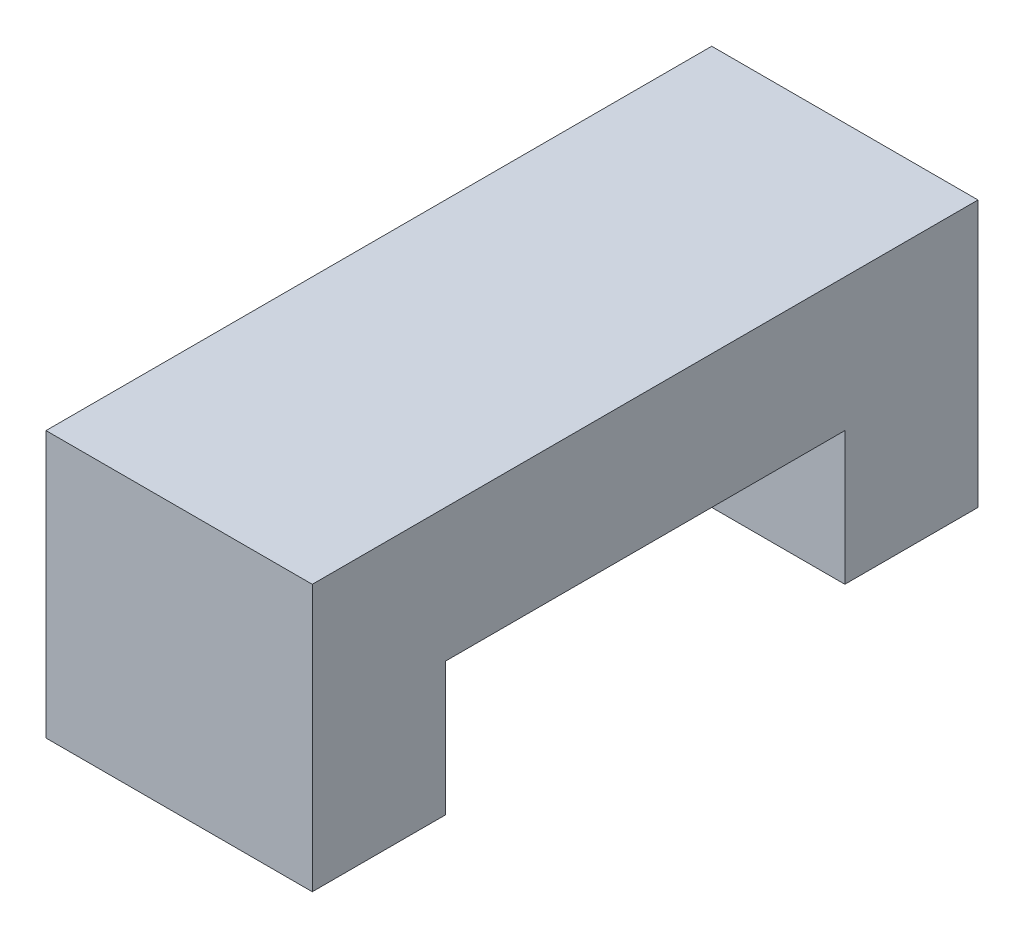
ISO-10303-21;
HEADER;
FILE_DESCRIPTION(('STEP AP214'),'2;1');
FILE_NAME('part.step','',(''),(''),'','','');
FILE_SCHEMA(('AUTOMOTIVE_DESIGN { 1 0 10303 214 1 1 1 1 }'));
ENDSEC;
DATA;
#1=APPLICATION_CONTEXT('core data for automotive mechanical design processes');
#2=APPLICATION_PROTOCOL_DEFINITION('international standard','automotive_design',2000,#1);
#3=PRODUCT_CONTEXT('',#1,'mechanical');
#4=PRODUCT('Part','Part','',(#3));
#5=PRODUCT_RELATED_PRODUCT_CATEGORY('part','',(#4));
#6=PRODUCT_DEFINITION_FORMATION('','',#4);
#7=PRODUCT_DEFINITION_CONTEXT('part definition',#1,'design');
#8=PRODUCT_DEFINITION('design','',#6,#7);
#9=PRODUCT_DEFINITION_SHAPE('','',#8);
#10=(LENGTH_UNIT() NAMED_UNIT(*) SI_UNIT(.MILLI.,.METRE.));
#11=(NAMED_UNIT(*) PLANE_ANGLE_UNIT() SI_UNIT($,.RADIAN.));
#12=(NAMED_UNIT(*) SI_UNIT($,.STERADIAN.) SOLID_ANGLE_UNIT());
#13=UNCERTAINTY_MEASURE_WITH_UNIT(LENGTH_MEASURE(1.E-05),#10,'distance_accuracy_value','');
#14=(GEOMETRIC_REPRESENTATION_CONTEXT(3) GLOBAL_UNCERTAINTY_ASSIGNED_CONTEXT((#13)) GLOBAL_UNIT_ASSIGNED_CONTEXT((#10,
#11,#12)) REPRESENTATION_CONTEXT('',''));
#15=CARTESIAN_POINT('',(0.,0.,0.));
#16=DIRECTION('',(0.,0.,1.));
#17=DIRECTION('',(1.,0.,0.));
#18=AXIS2_PLACEMENT_3D('',#15,#16,#17);
#19=CARTESIAN_POINT('',(10.,5.,0.));
#20=DIRECTION('',(0.,0.,1.));
#21=DIRECTION('',(1.,0.,0.));
#22=AXIS2_PLACEMENT_3D('',#19,#20,#21);
#23=PLANE('',#22);
#24=DIRECTION('',(0.,1.,0.));
#25=VECTOR('',#24,1.);
#26=CARTESIAN_POINT('',(0.,5.,0.));
#27=LINE('',#26,#25);
#28=CARTESIAN_POINT('',(0.,0.,0.));
#29=VERTEX_POINT('',#28);
#30=CARTESIAN_POINT('',(0.,5.,0.));
#31=VERTEX_POINT('',#30);
#32=EDGE_CURVE('E139',#29,#31,#27,.T.);
#33=ORIENTED_EDGE('',*,*,#32,.T.);
#34=DIRECTION('',(-1.,0.,0.));
#35=VECTOR('',#34,1.);
#36=CARTESIAN_POINT('',(10.,5.,0.));
#37=LINE('',#36,#35);
#38=CARTESIAN_POINT('',(10.,5.,0.));
#39=VERTEX_POINT('',#38);
#40=EDGE_CURVE('E11',#39,#31,#37,.T.);
#41=ORIENTED_EDGE('',*,*,#40,.F.);
#42=DIRECTION('',(0.,1.,0.));
#43=VECTOR('',#42,1.);
#44=CARTESIAN_POINT('',(10.,5.,0.));
#45=LINE('',#44,#43);
#46=CARTESIAN_POINT('',(10.,0.,0.));
#47=VERTEX_POINT('',#46);
#48=EDGE_CURVE('E153',#47,#39,#45,.T.);
#49=ORIENTED_EDGE('',*,*,#48,.F.);
#50=DIRECTION('',(-1.,0.,0.));
#51=VECTOR('',#50,1.);
#52=CARTESIAN_POINT('',(10.,0.,0.));
#53=LINE('',#52,#51);
#54=EDGE_CURVE('E135',#47,#29,#53,.T.);
#55=ORIENTED_EDGE('',*,*,#54,.T.);
#56=EDGE_LOOP('',(#33,#41,#49,#55));
#57=FACE_BOUND('',#56,.T.);
#58=ADVANCED_FACE('F43',(#57),#23,.F.);
#59=CARTESIAN_POINT('',(10.,5.,-15.));
#60=DIRECTION('',(0.,1.,0.));
#61=DIRECTION('',(0.,0.,1.));
#62=AXIS2_PLACEMENT_3D('',#59,#60,#61);
#63=PLANE('',#62);
#64=DIRECTION('',(0.,0.,-1.));
#65=VECTOR('',#64,1.);
#66=CARTESIAN_POINT('',(0.,5.,-15.));
#67=LINE('',#66,#65);
#68=CARTESIAN_POINT('',(0.,5.,-15.));
#69=VERTEX_POINT('',#68);
#70=EDGE_CURVE('E142',#31,#69,#67,.T.);
#71=ORIENTED_EDGE('',*,*,#70,.T.);
#72=DIRECTION('',(-1.,0.,0.));
#73=VECTOR('',#72,1.);
#74=CARTESIAN_POINT('',(10.,5.,-15.));
#75=LINE('',#74,#73);
#76=CARTESIAN_POINT('',(10.,5.,-15.));
#77=VERTEX_POINT('',#76);
#78=EDGE_CURVE('E51',#77,#69,#75,.T.);
#79=ORIENTED_EDGE('',*,*,#78,.F.);
#80=DIRECTION('',(0.,0.,-1.));
#81=VECTOR('',#80,1.);
#82=CARTESIAN_POINT('',(10.,5.,-15.));
#83=LINE('',#82,#81);
#84=EDGE_CURVE('E102',#39,#77,#83,.T.);
#85=ORIENTED_EDGE('',*,*,#84,.F.);
#86=ORIENTED_EDGE('',*,*,#40,.T.);
#87=EDGE_LOOP('',(#71,#79,#85,#86));
#88=FACE_BOUND('',#87,.T.);
#89=ADVANCED_FACE('F188',(#88),#63,.F.);
#90=CARTESIAN_POINT('',(10.,0.,-15.));
#91=DIRECTION('',(0.,0.,-1.));
#92=DIRECTION('',(-1.,0.,0.));
#93=AXIS2_PLACEMENT_3D('',#90,#91,#92);
#94=PLANE('',#93);
#95=DIRECTION('',(0.,-1.,0.));
#96=VECTOR('',#95,1.);
#97=CARTESIAN_POINT('',(0.,0.,-15.));
#98=LINE('',#97,#96);
#99=CARTESIAN_POINT('',(0.,0.,-15.));
#100=VERTEX_POINT('',#99);
#101=EDGE_CURVE('E144',#69,#100,#98,.T.);
#102=ORIENTED_EDGE('',*,*,#101,.T.);
#103=DIRECTION('',(-1.,0.,0.));
#104=VECTOR('',#103,1.);
#105=CARTESIAN_POINT('',(10.,0.,-15.));
#106=LINE('',#105,#104);
#107=CARTESIAN_POINT('',(10.,0.,-15.));
#108=VERTEX_POINT('',#107);
#109=EDGE_CURVE('E160',#108,#100,#106,.T.);
#110=ORIENTED_EDGE('',*,*,#109,.F.);
#111=DIRECTION('',(0.,-1.,0.));
#112=VECTOR('',#111,1.);
#113=CARTESIAN_POINT('',(10.,0.,-15.));
#114=LINE('',#113,#112);
#115=EDGE_CURVE('E168',#77,#108,#114,.T.);
#116=ORIENTED_EDGE('',*,*,#115,.F.);
#117=ORIENTED_EDGE('',*,*,#78,.T.);
#118=EDGE_LOOP('',(#102,#110,#116,#117));
#119=FACE_BOUND('',#118,.T.);
#120=ADVANCED_FACE('F166',(#119),#94,.F.);
#121=CARTESIAN_POINT('',(10.,0.,-20.));
#122=DIRECTION('',(0.,1.,0.));
#123=DIRECTION('',(0.,0.,1.));
#124=AXIS2_PLACEMENT_3D('',#121,#122,#123);
#125=PLANE('',#124);
#126=DIRECTION('',(0.,0.,-1.));
#127=VECTOR('',#126,1.);
#128=CARTESIAN_POINT('',(0.,0.,-20.));
#129=LINE('',#128,#127);
#130=CARTESIAN_POINT('',(0.,0.,-20.));
#131=VERTEX_POINT('',#130);
#132=EDGE_CURVE('E146',#100,#131,#129,.T.);
#133=ORIENTED_EDGE('',*,*,#132,.T.);
#134=DIRECTION('',(-1.,0.,0.));
#135=VECTOR('',#134,1.);
#136=CARTESIAN_POINT('',(10.,0.,-20.));
#137=LINE('',#136,#135);
#138=CARTESIAN_POINT('',(10.,0.,-20.));
#139=VERTEX_POINT('',#138);
#140=EDGE_CURVE('E157',#139,#131,#137,.T.);
#141=ORIENTED_EDGE('',*,*,#140,.F.);
#142=DIRECTION('',(0.,0.,-1.));
#143=VECTOR('',#142,1.);
#144=CARTESIAN_POINT('',(10.,0.,-20.));
#145=LINE('',#144,#143);
#146=EDGE_CURVE('E180',#108,#139,#145,.T.);
#147=ORIENTED_EDGE('',*,*,#146,.F.);
#148=ORIENTED_EDGE('',*,*,#109,.T.);
#149=EDGE_LOOP('',(#133,#141,#147,#148));
#150=FACE_BOUND('',#149,.T.);
#151=ADVANCED_FACE('F176',(#150),#125,.F.);
#152=CARTESIAN_POINT('',(10.,10.,-20.));
#153=DIRECTION('',(0.,0.,1.));
#154=DIRECTION('',(0.,-1.,0.));
#155=AXIS2_PLACEMENT_3D('',#152,#153,#154);
#156=PLANE('',#155);
#157=DIRECTION('',(0.,1.,0.));
#158=VECTOR('',#157,1.);
#159=CARTESIAN_POINT('',(0.,10.,-20.));
#160=LINE('',#159,#158);
#161=CARTESIAN_POINT('',(0.,10.,-20.));
#162=VERTEX_POINT('',#161);
#163=EDGE_CURVE('E148',#131,#162,#160,.T.);
#164=ORIENTED_EDGE('',*,*,#163,.T.);
#165=DIRECTION('',(-1.,0.,0.));
#166=VECTOR('',#165,1.);
#167=CARTESIAN_POINT('',(10.,10.,-20.));
#168=LINE('',#167,#166);
#169=CARTESIAN_POINT('',(10.,10.,-20.));
#170=VERTEX_POINT('',#169);
#171=EDGE_CURVE('E130',#170,#162,#168,.T.);
#172=ORIENTED_EDGE('',*,*,#171,.F.);
#173=DIRECTION('',(0.,1.,0.));
#174=VECTOR('',#173,1.);
#175=CARTESIAN_POINT('',(10.,10.,-20.));
#176=LINE('',#175,#174);
#177=EDGE_CURVE('E121',#139,#170,#176,.T.);
#178=ORIENTED_EDGE('',*,*,#177,.F.);
#179=ORIENTED_EDGE('',*,*,#140,.T.);
#180=EDGE_LOOP('',(#164,#172,#178,#179));
#181=FACE_BOUND('',#180,.T.);
#182=ADVANCED_FACE('F179',(#181),#156,.F.);
#183=CARTESIAN_POINT('',(10.,10.,5.));
#184=DIRECTION('',(0.,-1.,0.));
#185=DIRECTION('',(0.,0.,-1.));
#186=AXIS2_PLACEMENT_3D('',#183,#184,#185);
#187=PLANE('',#186);
#188=DIRECTION('',(0.,0.,1.));
#189=VECTOR('',#188,1.);
#190=CARTESIAN_POINT('',(0.,10.,5.));
#191=LINE('',#190,#189);
#192=CARTESIAN_POINT('',(0.,10.,5.));
#193=VERTEX_POINT('',#192);
#194=EDGE_CURVE('E129',#162,#193,#191,.T.);
#195=ORIENTED_EDGE('',*,*,#194,.T.);
#196=DIRECTION('',(-1.,0.,0.));
#197=VECTOR('',#196,1.);
#198=CARTESIAN_POINT('',(10.,10.,5.));
#199=LINE('',#198,#197);
#200=CARTESIAN_POINT('',(10.,10.,5.));
#201=VERTEX_POINT('',#200);
#202=EDGE_CURVE('E126',#201,#193,#199,.T.);
#203=ORIENTED_EDGE('',*,*,#202,.F.);
#204=DIRECTION('',(0.,0.,1.));
#205=VECTOR('',#204,1.);
#206=CARTESIAN_POINT('',(10.,10.,5.));
#207=LINE('',#206,#205);
#208=EDGE_CURVE('E115',#170,#201,#207,.T.);
#209=ORIENTED_EDGE('',*,*,#208,.F.);
#210=ORIENTED_EDGE('',*,*,#171,.T.);
#211=EDGE_LOOP('',(#195,#203,#209,#210));
#212=FACE_BOUND('',#211,.T.);
#213=ADVANCED_FACE('F127',(#212),#187,.F.);
#214=CARTESIAN_POINT('',(10.,0.,5.));
#215=DIRECTION('',(0.,0.,-1.));
#216=DIRECTION('',(-1.,0.,0.));
#217=AXIS2_PLACEMENT_3D('',#214,#215,#216);
#218=PLANE('',#217);
#219=DIRECTION('',(0.,-1.,0.));
#220=VECTOR('',#219,1.);
#221=CARTESIAN_POINT('',(0.,0.,5.));
#222=LINE('',#221,#220);
#223=CARTESIAN_POINT('',(0.,0.,5.));
#224=VERTEX_POINT('',#223);
#225=EDGE_CURVE('E88',#193,#224,#222,.T.);
#226=ORIENTED_EDGE('',*,*,#225,.T.);
#227=DIRECTION('',(-1.,0.,0.));
#228=VECTOR('',#227,1.);
#229=CARTESIAN_POINT('',(10.,0.,5.));
#230=LINE('',#229,#228);
#231=CARTESIAN_POINT('',(10.,0.,5.));
#232=VERTEX_POINT('',#231);
#233=EDGE_CURVE('E131',#232,#224,#230,.T.);
#234=ORIENTED_EDGE('',*,*,#233,.F.);
#235=DIRECTION('',(0.,-1.,0.));
#236=VECTOR('',#235,1.);
#237=CARTESIAN_POINT('',(10.,0.,5.));
#238=LINE('',#237,#236);
#239=EDGE_CURVE('E119',#201,#232,#238,.T.);
#240=ORIENTED_EDGE('',*,*,#239,.F.);
#241=ORIENTED_EDGE('',*,*,#202,.T.);
#242=EDGE_LOOP('',(#226,#234,#240,#241));
#243=FACE_BOUND('',#242,.T.);
#244=ADVANCED_FACE('F133',(#243),#218,.F.);
#245=CARTESIAN_POINT('',(10.,0.,0.));
#246=DIRECTION('',(0.,1.,0.));
#247=DIRECTION('',(0.,0.,1.));
#248=AXIS2_PLACEMENT_3D('',#245,#246,#247);
#249=PLANE('',#248);
#250=DIRECTION('',(0.,0.,-1.));
#251=VECTOR('',#250,1.);
#252=CARTESIAN_POINT('',(0.,0.,0.));
#253=LINE('',#252,#251);
#254=EDGE_CURVE('E94',#224,#29,#253,.T.);
#255=ORIENTED_EDGE('',*,*,#254,.T.);
#256=ORIENTED_EDGE('',*,*,#54,.F.);
#257=DIRECTION('',(0.,0.,-1.));
#258=VECTOR('',#257,1.);
#259=CARTESIAN_POINT('',(10.,0.,0.));
#260=LINE('',#259,#258);
#261=EDGE_CURVE('E59',#232,#47,#260,.T.);
#262=ORIENTED_EDGE('',*,*,#261,.F.);
#263=ORIENTED_EDGE('',*,*,#233,.T.);
#264=EDGE_LOOP('',(#255,#256,#262,#263));
#265=FACE_BOUND('',#264,.T.);
#266=ADVANCED_FACE('F204',(#265),#249,.F.);
#267=CARTESIAN_POINT('',(10.,0.,0.));
#268=DIRECTION('',(-1.,0.,0.));
#269=DIRECTION('',(0.,0.,1.));
#270=AXIS2_PLACEMENT_3D('',#267,#268,#269);
#271=PLANE('',#270);
#272=ORIENTED_EDGE('',*,*,#48,.T.);
#273=ORIENTED_EDGE('',*,*,#84,.T.);
#274=ORIENTED_EDGE('',*,*,#115,.T.);
#275=ORIENTED_EDGE('',*,*,#146,.T.);
#276=ORIENTED_EDGE('',*,*,#177,.T.);
#277=ORIENTED_EDGE('',*,*,#208,.T.);
#278=ORIENTED_EDGE('',*,*,#239,.T.);
#279=ORIENTED_EDGE('',*,*,#261,.T.);
#280=EDGE_LOOP('',(#272,#273,#274,#275,#276,#277,#278,#279));
#281=FACE_BOUND('',#280,.T.);
#282=ADVANCED_FACE('F117',(#281),#271,.F.);
#283=CARTESIAN_POINT('',(0.,0.,0.));
#284=DIRECTION('',(-1.,0.,0.));
#285=DIRECTION('',(0.,0.,1.));
#286=AXIS2_PLACEMENT_3D('',#283,#284,#285);
#287=PLANE('',#286);
#288=ORIENTED_EDGE('',*,*,#32,.F.);
#289=ORIENTED_EDGE('',*,*,#254,.F.);
#290=ORIENTED_EDGE('',*,*,#225,.F.);
#291=ORIENTED_EDGE('',*,*,#194,.F.);
#292=ORIENTED_EDGE('',*,*,#163,.F.);
#293=ORIENTED_EDGE('',*,*,#132,.F.);
#294=ORIENTED_EDGE('',*,*,#101,.F.);
#295=ORIENTED_EDGE('',*,*,#70,.F.);
#296=EDGE_LOOP('',(#288,#289,#290,#291,#292,#293,#294,#295));
#297=FACE_BOUND('',#296,.T.);
#298=ADVANCED_FACE('F172',(#297),#287,.T.);
#299=CLOSED_SHELL('',(#58,#89,#120,#151,#182,#213,#244,#266,#282,#298));
#300=MANIFOLD_SOLID_BREP('B2',#299);
#301=ADVANCED_BREP_SHAPE_REPRESENTATION('',(#18,#300),#14);
#302=SHAPE_DEFINITION_REPRESENTATION(#9,#301);
ENDSEC;
END-ISO-10303-21;
